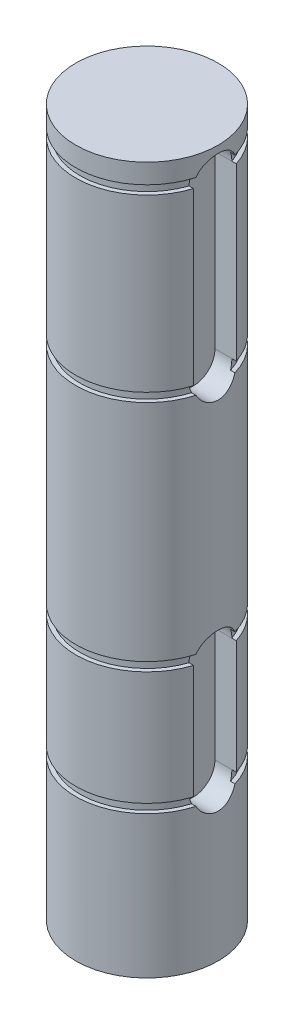
ISO-10303-21;
HEADER;
FILE_DESCRIPTION(('STEP AP214'),'2;1');
FILE_NAME('part.step','',(''),(''),'','','');
FILE_SCHEMA(('AUTOMOTIVE_DESIGN { 1 0 10303 214 1 1 1 1 }'));
ENDSEC;
DATA;
#1=APPLICATION_CONTEXT('core data for automotive mechanical design processes');
#2=APPLICATION_PROTOCOL_DEFINITION('international standard','automotive_design',2000,#1);
#3=PRODUCT_CONTEXT('',#1,'mechanical');
#4=PRODUCT('Part','Part','',(#3));
#5=PRODUCT_RELATED_PRODUCT_CATEGORY('part','',(#4));
#6=PRODUCT_DEFINITION_FORMATION('','',#4);
#7=PRODUCT_DEFINITION_CONTEXT('part definition',#1,'design');
#8=PRODUCT_DEFINITION('design','',#6,#7);
#9=PRODUCT_DEFINITION_SHAPE('','',#8);
#10=(LENGTH_UNIT() NAMED_UNIT(*) SI_UNIT(.MILLI.,.METRE.));
#11=(NAMED_UNIT(*) PLANE_ANGLE_UNIT() SI_UNIT($,.RADIAN.));
#12=(NAMED_UNIT(*) SI_UNIT($,.STERADIAN.) SOLID_ANGLE_UNIT());
#13=UNCERTAINTY_MEASURE_WITH_UNIT(LENGTH_MEASURE(1.E-05),#10,'distance_accuracy_value','');
#14=(GEOMETRIC_REPRESENTATION_CONTEXT(3) GLOBAL_UNCERTAINTY_ASSIGNED_CONTEXT((#13)) GLOBAL_UNIT_ASSIGNED_CONTEXT((#10,
#11,#12)) REPRESENTATION_CONTEXT('',''));
#15=CARTESIAN_POINT('',(0.,0.,0.));
#16=DIRECTION('',(0.,0.,1.));
#17=DIRECTION('',(1.,0.,0.));
#18=AXIS2_PLACEMENT_3D('',#15,#16,#17);
#19=CARTESIAN_POINT('',(0.,31.02,0.));
#20=DIRECTION('',(0.,-1.,0.));
#21=DIRECTION('',(0.,0.,-1.));
#22=AXIS2_PLACEMENT_3D('',#19,#20,#21);
#23=CYLINDRICAL_SURFACE('',#22,3.125);
#24=DIRECTION('',(0.,-1.,0.));
#25=VECTOR('',#24,1.);
#26=CARTESIAN_POINT('',(2.98027263853494,31.02,-0.939999999999998));
#27=LINE('',#26,#25);
#28=CARTESIAN_POINT('',(2.98027263853494,6.64,-0.94));
#29=VERTEX_POINT('',#28);
#30=CARTESIAN_POINT('',(2.98027263853494,11.64,-0.94));
#31=VERTEX_POINT('',#30);
#32=EDGE_CURVE('E691',#29,#31,#27,.F.);
#33=ORIENTED_EDGE('',*,*,#32,.F.);
#34=CARTESIAN_POINT('',(0.,6.64,0.));
#35=DIRECTION('',(0.,1.,0.));
#36=DIRECTION('',(0.,0.,1.));
#37=AXIS2_PLACEMENT_3D('',#34,#35,#36);
#38=CIRCLE('',#37,3.125);
#39=CARTESIAN_POINT('',(2.98027263853494,6.64,0.939999999999999));
#40=VERTEX_POINT('',#39);
#41=EDGE_CURVE('E321',#29,#40,#38,.T.);
#42=ORIENTED_EDGE('',*,*,#41,.T.);
#43=DIRECTION('',(0.,-1.,0.));
#44=VECTOR('',#43,1.);
#45=CARTESIAN_POINT('',(2.98027263853494,31.02,0.940000000000003));
#46=LINE('',#45,#44);
#47=CARTESIAN_POINT('',(2.98027263853494,11.64,0.94));
#48=VERTEX_POINT('',#47);
#49=EDGE_CURVE('E695',#40,#48,#46,.F.);
#50=ORIENTED_EDGE('',*,*,#49,.T.);
#51=CARTESIAN_POINT('',(0.,11.64,0.));
#52=DIRECTION('',(0.,-1.,0.));
#53=DIRECTION('',(0.,0.,-1.));
#54=AXIS2_PLACEMENT_3D('',#51,#52,#53);
#55=CIRCLE('',#54,3.125);
#56=EDGE_CURVE('E329',#48,#31,#55,.T.);
#57=ORIENTED_EDGE('',*,*,#56,.T.);
#58=EDGE_LOOP('',(#33,#42,#50,#57));
#59=FACE_BOUND('',#58,.T.);
#60=ADVANCED_FACE('F33',(#59),#23,.T.);
#61=CARTESIAN_POINT('',(0.,11.64,6.6989213564024));
#62=DIRECTION('',(0.,-1.,0.));
#63=DIRECTION('',(0.,0.,-1.));
#64=AXIS2_PLACEMENT_3D('',#61,#62,#63);
#65=PLANE('',#64);
#66=DIRECTION('',(1.,0.,0.));
#67=VECTOR('',#66,1.);
#68=CARTESIAN_POINT('',(2.045,11.64,-0.94));
#69=LINE('',#68,#67);
#70=CARTESIAN_POINT('',(2.78567765543682,11.64,-0.94));
#71=VERTEX_POINT('',#70);
#72=EDGE_CURVE('E205',#71,#31,#69,.T.);
#73=ORIENTED_EDGE('',*,*,#72,.T.);
#74=ORIENTED_EDGE('',*,*,#56,.F.);
#75=DIRECTION('',(1.,0.,0.));
#76=VECTOR('',#75,1.);
#77=CARTESIAN_POINT('',(2.045,11.64,0.94));
#78=LINE('',#77,#76);
#79=CARTESIAN_POINT('',(2.78567765543682,11.64,0.94));
#80=VERTEX_POINT('',#79);
#81=EDGE_CURVE('E184',#80,#48,#78,.T.);
#82=ORIENTED_EDGE('',*,*,#81,.F.);
#83=CARTESIAN_POINT('',(0.,11.64,0.));
#84=DIRECTION('',(0.,1.,0.));
#85=DIRECTION('',(0.,0.,1.));
#86=AXIS2_PLACEMENT_3D('',#83,#84,#85);
#87=CIRCLE('',#86,2.94);
#88=EDGE_CURVE('E330',#71,#80,#87,.T.);
#89=ORIENTED_EDGE('',*,*,#88,.F.);
#90=EDGE_LOOP('',(#73,#74,#82,#89));
#91=FACE_BOUND('',#90,.T.);
#92=ADVANCED_FACE('F252',(#91),#65,.F.);
#93=DIRECTION('',(0.,-1.,0.));
#94=VECTOR('',#93,1.);
#95=CARTESIAN_POINT('',(2.98027263853494,31.02,-0.94));
#96=LINE('',#95,#94);
#97=CARTESIAN_POINT('',(2.98027263853494,22.27,-0.94));
#98=VERTEX_POINT('',#97);
#99=CARTESIAN_POINT('',(2.98027263853494,29.77,-0.94));
#100=VERTEX_POINT('',#99);
#101=EDGE_CURVE('E484',#98,#100,#96,.F.);
#102=ORIENTED_EDGE('',*,*,#101,.F.);
#103=CARTESIAN_POINT('',(0.,22.27,0.));
#104=DIRECTION('',(0.,1.,0.));
#105=DIRECTION('',(0.,0.,1.));
#106=AXIS2_PLACEMENT_3D('',#103,#104,#105);
#107=CIRCLE('',#106,3.125);
#108=CARTESIAN_POINT('',(2.98027263853494,22.27,0.939999999999999));
#109=VERTEX_POINT('',#108);
#110=EDGE_CURVE('E334',#98,#109,#107,.T.);
#111=ORIENTED_EDGE('',*,*,#110,.T.);
#112=DIRECTION('',(0.,-1.,0.));
#113=VECTOR('',#112,1.);
#114=CARTESIAN_POINT('',(2.98027263853494,31.02,0.94));
#115=LINE('',#114,#113);
#116=CARTESIAN_POINT('',(2.98027263853494,29.77,0.94));
#117=VERTEX_POINT('',#116);
#118=EDGE_CURVE('E482',#109,#117,#115,.F.);
#119=ORIENTED_EDGE('',*,*,#118,.T.);
#120=CARTESIAN_POINT('',(0.,29.77,0.));
#121=DIRECTION('',(0.,-1.,0.));
#122=DIRECTION('',(0.,0.,-1.));
#123=AXIS2_PLACEMENT_3D('',#120,#121,#122);
#124=CIRCLE('',#123,3.125);
#125=EDGE_CURVE('E343',#117,#100,#124,.T.);
#126=ORIENTED_EDGE('',*,*,#125,.T.);
#127=EDGE_LOOP('',(#102,#111,#119,#126));
#128=FACE_BOUND('',#127,.T.);
#129=ADVANCED_FACE('F256',(#128),#23,.T.);
#130=CARTESIAN_POINT('',(0.,29.77,8.25905998612194));
#131=DIRECTION('',(0.,-1.,0.));
#132=DIRECTION('',(0.,0.,-1.));
#133=AXIS2_PLACEMENT_3D('',#130,#131,#132);
#134=PLANE('',#133);
#135=DIRECTION('',(1.,0.,0.));
#136=VECTOR('',#135,1.);
#137=CARTESIAN_POINT('',(2.045,29.77,-0.94));
#138=LINE('',#137,#136);
#139=CARTESIAN_POINT('',(2.78567765543682,29.77,-0.94));
#140=VERTEX_POINT('',#139);
#141=EDGE_CURVE('E466',#140,#100,#138,.T.);
#142=ORIENTED_EDGE('',*,*,#141,.T.);
#143=ORIENTED_EDGE('',*,*,#125,.F.);
#144=DIRECTION('',(1.,0.,0.));
#145=VECTOR('',#144,1.);
#146=CARTESIAN_POINT('',(2.045,29.77,0.94));
#147=LINE('',#146,#145);
#148=CARTESIAN_POINT('',(2.78567765543682,29.77,0.94));
#149=VERTEX_POINT('',#148);
#150=EDGE_CURVE('E462',#149,#117,#147,.T.);
#151=ORIENTED_EDGE('',*,*,#150,.F.);
#152=CARTESIAN_POINT('',(0.,29.77,0.));
#153=DIRECTION('',(0.,1.,0.));
#154=DIRECTION('',(0.,0.,1.));
#155=AXIS2_PLACEMENT_3D('',#152,#153,#154);
#156=CIRCLE('',#155,2.94);
#157=EDGE_CURVE('E344',#140,#149,#156,.T.);
#158=ORIENTED_EDGE('',*,*,#157,.F.);
#159=EDGE_LOOP('',(#142,#143,#151,#158));
#160=FACE_BOUND('',#159,.T.);
#161=ADVANCED_FACE('F291',(#160),#134,.F.);
#162=CARTESIAN_POINT('',(0.,21.88,0.));
#163=DIRECTION('',(0.,-1.,0.));
#164=DIRECTION('',(0.,0.,-1.));
#165=AXIS2_PLACEMENT_3D('',#162,#163,#164);
#166=CIRCLE('',#165,3.125);
#167=CARTESIAN_POINT('',(3.00568211892076,21.88,0.855277732669335));
#168=VERTEX_POINT('',#167);
#169=CARTESIAN_POINT('',(3.00568211892076,21.88,-0.855277732669335));
#170=VERTEX_POINT('',#169);
#171=EDGE_CURVE('E337',#168,#170,#166,.T.);
#172=ORIENTED_EDGE('',*,*,#171,.T.);
#173=CARTESIAN_POINT('',(3.00568211892076,21.88,-0.855277732669335));
#174=CARTESIAN_POINT('',(3.01197611217758,21.8313698895519,-0.833136228877787));
#175=CARTESIAN_POINT('',(3.01919775324544,21.7847898873477,-0.806858075150072));
#176=CARTESIAN_POINT('',(3.03458192240252,21.6968394871603,-0.746928149763597));
#177=CARTESIAN_POINT('',(3.04274406058385,21.6554669450655,-0.713279428592252));
#178=CARTESIAN_POINT('',(3.05910120550064,21.5790003474044,-0.63948971254401));
#179=CARTESIAN_POINT('',(3.06729621095687,21.5439060498633,-0.599348967994875));
#180=CARTESIAN_POINT('',(3.08281079902333,21.4809318372791,-0.513612744111755));
#181=CARTESIAN_POINT('',(3.0901305429699,21.4530505915533,-0.468018273168346));
#182=CARTESIAN_POINT('',(3.10308315937434,21.4053442344126,-0.372579156757472));
#183=CARTESIAN_POINT('',(3.10871654938764,21.3855166505968,-0.322735821346341));
#184=CARTESIAN_POINT('',(3.11765565733985,21.3545914483087,-0.220209060884308));
#185=CARTESIAN_POINT('',(3.12096182013791,21.3434921613387,-0.167526180698143));
#186=CARTESIAN_POINT('',(3.12478789265651,21.3306864235816,-0.0629395106332579));
#187=CARTESIAN_POINT('',(3.12540746867013,21.328643919445,-0.0110803793365449));
#188=CARTESIAN_POINT('',(3.12406570105473,21.3331082537071,0.0922290153420545));
#189=CARTESIAN_POINT('',(3.12210470969837,21.3396139251961,0.143679333566428));
#190=CARTESIAN_POINT('',(3.11587937110205,21.3607270041869,0.243690581712505));
#191=CARTESIAN_POINT('',(3.11166026711456,21.3751754211278,0.292288134105934));
#192=CARTESIAN_POINT('',(3.10138427837202,21.4115925566497,0.386370452039638));
#193=CARTESIAN_POINT('',(3.09532708770704,21.4335625271093,0.431854697891666));
#194=CARTESIAN_POINT('',(3.08180586284076,21.4850578680789,0.519738685975642));
#195=CARTESIAN_POINT('',(3.07430890253973,21.514767430438,0.562025261028504));
#196=CARTESIAN_POINT('',(3.05879365274378,21.580640257947,0.641117728480937));
#197=CARTESIAN_POINT('',(3.05077539725478,21.6168031023944,0.677923977867188));
#198=CARTESIAN_POINT('',(3.03612090925513,21.689408020399,0.740601235513018));
#199=CARTESIAN_POINT('',(3.02944450317571,21.7251499149957,0.767278041987932));
#200=CARTESIAN_POINT('',(3.01685829784125,21.8001198007243,0.81535345165774));
#201=CARTESIAN_POINT('',(3.01094815880578,21.8393462336387,0.83675439811143));
#202=CARTESIAN_POINT('',(3.00568211892076,21.88,0.855277732669335));
#203=B_SPLINE_CURVE_WITH_KNOTS('',3,(#173,#174,#175,#176,#177,#178,#179,#180,#181,#182,#183,
#184,#185,#186,#187,#188,#189,#190,#191,#192,#193,#194,#195,#196,#197,#198,#199,#200,#201,#202),
.UNSPECIFIED.,.F.,.F.,(4,2,2,2,2,2,2,2,2,2,2,2,2,2,4),(0.,0.161152208374374,0.3222378456118,
0.483317272982924,0.644366962775478,0.805367174343245,0.966336601687735,1.12128038599228,
1.27620302115001,1.42813187036151,1.58008601873696,1.73605274217507,1.89200930154131,
2.02685875712088,2.16164821133935),.UNSPECIFIED.);
#204=EDGE_CURVE('E406',#170,#168,#203,.T.);
#205=ORIENTED_EDGE('',*,*,#204,.T.);
#206=EDGE_LOOP('',(#172,#205));
#207=FACE_BOUND('',#206,.T.);
#208=CARTESIAN_POINT('',(0.,12.03,0.));
#209=DIRECTION('',(0.,1.,0.));
#210=DIRECTION('',(0.,0.,1.));
#211=AXIS2_PLACEMENT_3D('',#208,#209,#210);
#212=CIRCLE('',#211,3.125);
#213=CARTESIAN_POINT('',(3.00568211892076,12.03,-0.855277732669336));
#214=VERTEX_POINT('',#213);
#215=CARTESIAN_POINT('',(3.00568211892076,12.03,0.855277732669337));
#216=VERTEX_POINT('',#215);
#217=EDGE_CURVE('E326',#214,#216,#212,.T.);
#218=ORIENTED_EDGE('',*,*,#217,.T.);
#219=CARTESIAN_POINT('',(3.00568211892076,12.03,0.855277732669337));
#220=CARTESIAN_POINT('',(3.01197611217757,12.0786301104481,0.833136228877789));
#221=CARTESIAN_POINT('',(3.01919775324544,12.1252101126523,0.806858075150075));
#222=CARTESIAN_POINT('',(3.03458192240252,12.2131605128397,0.746928149763601));
#223=CARTESIAN_POINT('',(3.04274406058385,12.2545330549345,0.713279428592255));
#224=CARTESIAN_POINT('',(3.05910120550064,12.3309996525956,0.639489712544013));
#225=CARTESIAN_POINT('',(3.06729621095687,12.3660939501367,0.599348967994878));
#226=CARTESIAN_POINT('',(3.08281079902333,12.4290681627209,0.513612744111759));
#227=CARTESIAN_POINT('',(3.0901305429699,12.4569494084467,0.46801827316835));
#228=CARTESIAN_POINT('',(3.10308315937434,12.5046557655874,0.372579156757477));
#229=CARTESIAN_POINT('',(3.10871654938764,12.5244833494032,0.322735821346345));
#230=CARTESIAN_POINT('',(3.11765565733985,12.5554085516913,0.220209060884311));
#231=CARTESIAN_POINT('',(3.12096182013791,12.5665078386613,0.167526180698147));
#232=CARTESIAN_POINT('',(3.12478789265651,12.5793135764184,0.0629395106332619));
#233=CARTESIAN_POINT('',(3.12540746867013,12.5813560805551,0.0110803793365491));
#234=CARTESIAN_POINT('',(3.12406570105473,12.576891746293,-0.0922290153420505));
#235=CARTESIAN_POINT('',(3.12210470969837,12.5703860748039,-0.143679333566424));
#236=CARTESIAN_POINT('',(3.11587937110205,12.5492729958131,-0.243690581712502));
#237=CARTESIAN_POINT('',(3.11166026711456,12.5348245788722,-0.292288134105929));
#238=CARTESIAN_POINT('',(3.10138427837202,12.4984074433503,-0.386370452039633));
#239=CARTESIAN_POINT('',(3.09532708770704,12.4764374728907,-0.431854697891662));
#240=CARTESIAN_POINT('',(3.08180586284076,12.4249421319211,-0.519738685975639));
#241=CARTESIAN_POINT('',(3.07430890253973,12.395232569562,-0.562025261028501));
#242=CARTESIAN_POINT('',(3.05879365274378,12.3293597420531,-0.641117728480934));
#243=CARTESIAN_POINT('',(3.05077539725478,12.2931968976056,-0.677923977867185));
#244=CARTESIAN_POINT('',(3.03612090925513,12.220591979601,-0.740601235513016));
#245=CARTESIAN_POINT('',(3.02944450317571,12.1848500850043,-0.767278041987931));
#246=CARTESIAN_POINT('',(3.01685829784125,12.1098801992757,-0.815353451657741));
#247=CARTESIAN_POINT('',(3.01094815880578,12.0706537663613,-0.836754398111431));
#248=CARTESIAN_POINT('',(3.00568211892076,12.03,-0.855277732669337));
#249=B_SPLINE_CURVE_WITH_KNOTS('',3,(#219,#220,#221,#222,#223,#224,#225,#226,#227,#228,#229,
#230,#231,#232,#233,#234,#235,#236,#237,#238,#239,#240,#241,#242,#243,#244,#245,#246,#247,#248),
.UNSPECIFIED.,.F.,.F.,(4,2,2,2,2,2,2,2,2,2,2,2,2,2,4),(0.,0.161152208374372,0.322237845611799,
0.483317272982923,0.644366962775477,0.805367174343245,0.966336601687735,1.12128038599228,
1.27620302115001,1.42813187036151,1.58008601873696,1.73605274217507,1.89200930154131,
2.02685875712089,2.16164821133936),.UNSPECIFIED.);
#250=EDGE_CURVE('E213',#216,#214,#249,.T.);
#251=ORIENTED_EDGE('',*,*,#250,.T.);
#252=EDGE_LOOP('',(#218,#251));
#253=FACE_BOUND('',#252,.T.);
#254=ADVANCED_FACE('F282',(#207,#253),#23,.T.);
#255=CARTESIAN_POINT('',(0.,6.25,0.));
#256=DIRECTION('',(0.,-1.,0.));
#257=DIRECTION('',(0.,0.,-1.));
#258=AXIS2_PLACEMENT_3D('',#255,#256,#257);
#259=CIRCLE('',#258,3.125);
#260=CARTESIAN_POINT('',(3.00568211892076,6.25,0.855277732669337));
#261=VERTEX_POINT('',#260);
#262=CARTESIAN_POINT('',(3.00568211892076,6.25,-0.855277732669336));
#263=VERTEX_POINT('',#262);
#264=EDGE_CURVE('E315',#261,#263,#259,.T.);
#265=ORIENTED_EDGE('',*,*,#264,.T.);
#266=CARTESIAN_POINT('',(3.00568211892076,6.25,-0.855277732669337));
#267=CARTESIAN_POINT('',(3.01197611217757,6.20136988955189,-0.83313622887779));
#268=CARTESIAN_POINT('',(3.01919775324544,6.15478988734766,-0.806858075150075));
#269=CARTESIAN_POINT('',(3.03458192240252,6.06683948716027,-0.7469281497636));
#270=CARTESIAN_POINT('',(3.04274406058385,6.02546694506551,-0.713279428592254));
#271=CARTESIAN_POINT('',(3.05910120550064,5.9490003474044,-0.639489712544012));
#272=CARTESIAN_POINT('',(3.06729621095687,5.91390604986329,-0.599348967994876));
#273=CARTESIAN_POINT('',(3.08281079902333,5.85093183727906,-0.513612744111757));
#274=CARTESIAN_POINT('',(3.0901305429699,5.8230505915533,-0.468018273168348));
#275=CARTESIAN_POINT('',(3.10308315937434,5.77534423441264,-0.372579156757475));
#276=CARTESIAN_POINT('',(3.10871654938764,5.7555166505968,-0.322735821346343));
#277=CARTESIAN_POINT('',(3.11765565733985,5.72459144830873,-0.22020906088431));
#278=CARTESIAN_POINT('',(3.12096182013791,5.71349216133873,-0.167526180698146));
#279=CARTESIAN_POINT('',(3.12478789265651,5.70068642358156,-0.0629395106332611));
#280=CARTESIAN_POINT('',(3.12540746867013,5.69864391944495,-0.0110803793365481));
#281=CARTESIAN_POINT('',(3.12406570105473,5.70310825370705,0.0922290153420516));
#282=CARTESIAN_POINT('',(3.12210470969837,5.70961392519606,0.143679333566425));
#283=CARTESIAN_POINT('',(3.11587937110205,5.73072700418688,0.243690581712502));
#284=CARTESIAN_POINT('',(3.11166026711456,5.74517542112777,0.29228813410593));
#285=CARTESIAN_POINT('',(3.10138427837202,5.78159255664966,0.386370452039634));
#286=CARTESIAN_POINT('',(3.09532708770704,5.80356252710926,0.431854697891663));
#287=CARTESIAN_POINT('',(3.08180586284076,5.85505786807891,0.51973868597564));
#288=CARTESIAN_POINT('',(3.07430890253973,5.884767430438,0.562025261028502));
#289=CARTESIAN_POINT('',(3.05879365274378,5.95064025794695,0.641117728480935));
#290=CARTESIAN_POINT('',(3.05077539725478,5.98680310239438,0.677923977867186));
#291=CARTESIAN_POINT('',(3.03612090925513,6.05940802039897,0.740601235513017));
#292=CARTESIAN_POINT('',(3.02944450317571,6.09514991499573,0.767278041987932));
#293=CARTESIAN_POINT('',(3.01685829784125,6.17011980072427,0.815353451657741));
#294=CARTESIAN_POINT('',(3.01094815880577,6.20934623363868,0.836754398111432));
#295=CARTESIAN_POINT('',(3.00568211892076,6.25,0.855277732669337));
#296=B_SPLINE_CURVE_WITH_KNOTS('',3,(#266,#267,#268,#269,#270,#271,#272,#273,#274,#275,#276,
#277,#278,#279,#280,#281,#282,#283,#284,#285,#286,#287,#288,#289,#290,#291,#292,#293,#294,#295),
.UNSPECIFIED.,.F.,.F.,(4,2,2,2,2,2,2,2,2,2,2,2,2,2,4),(0.,0.161152208374373,0.3222378456118,
0.483317272982925,0.64436696277548,0.805367174343246,0.966336601687735,1.12128038599228,
1.27620302115001,1.42813187036151,1.58008601873696,1.73605274217507,1.89200930154131,
2.02685875712089,2.16164821133936),.UNSPECIFIED.);
#297=EDGE_CURVE('E444',#263,#261,#296,.T.);
#298=ORIENTED_EDGE('',*,*,#297,.T.);
#299=EDGE_LOOP('',(#265,#298));
#300=FACE_BOUND('',#299,.T.);
#301=CARTESIAN_POINT('',(0.,0.,0.));
#302=DIRECTION('',(0.,1.,0.));
#303=DIRECTION('',(0.,0.,1.));
#304=AXIS2_PLACEMENT_3D('',#301,#302,#303);
#305=CIRCLE('',#304,3.125);
#306=CARTESIAN_POINT('',(0.,0.,3.125));
#307=VERTEX_POINT('',#306);
#308=EDGE_CURVE('E310',#307,#307,#305,.T.);
#309=ORIENTED_EDGE('',*,*,#308,.T.);
#310=EDGE_LOOP('',(#309));
#311=FACE_BOUND('',#310,.T.);
#312=ADVANCED_FACE('F277',(#300,#311),#23,.T.);
#313=CARTESIAN_POINT('',(0.,0.,0.));
#314=DIRECTION('',(0.,1.,0.));
#315=DIRECTION('',(0.,0.,1.));
#316=AXIS2_PLACEMENT_3D('',#313,#314,#315);
#317=PLANE('',#316);
#318=ORIENTED_EDGE('',*,*,#308,.F.);
#319=EDGE_LOOP('',(#318));
#320=FACE_BOUND('',#319,.T.);
#321=ADVANCED_FACE('F270',(#320),#317,.F.);
#322=CARTESIAN_POINT('',(0.,6.25,6.84511449295975));
#323=DIRECTION('',(0.,-1.,0.));
#324=DIRECTION('',(0.,0.,-1.));
#325=AXIS2_PLACEMENT_3D('',#322,#323,#324);
#326=PLANE('',#325);
#327=CARTESIAN_POINT('',(0.,6.25,0.));
#328=DIRECTION('',(0.,1.,0.));
#329=DIRECTION('',(0.,0.,1.));
#330=AXIS2_PLACEMENT_3D('',#327,#328,#329);
#331=CIRCLE('',#330,2.94);
#332=CARTESIAN_POINT('',(2.81284553432996,6.25,-0.855277732669336));
#333=VERTEX_POINT('',#332);
#334=CARTESIAN_POINT('',(2.81284553432996,6.25,0.855277732669336));
#335=VERTEX_POINT('',#334);
#336=EDGE_CURVE('E318',#333,#335,#331,.T.);
#337=ORIENTED_EDGE('',*,*,#336,.F.);
#338=DIRECTION('',(1.,0.,0.));
#339=VECTOR('',#338,1.);
#340=CARTESIAN_POINT('',(2.045,6.25,-0.855277732669336));
#341=LINE('',#340,#339);
#342=EDGE_CURVE('E439',#333,#263,#341,.T.);
#343=ORIENTED_EDGE('',*,*,#342,.T.);
#344=ORIENTED_EDGE('',*,*,#264,.F.);
#345=DIRECTION('',(1.,0.,0.));
#346=VECTOR('',#345,1.);
#347=CARTESIAN_POINT('',(2.045,6.25,0.855277732669336));
#348=LINE('',#347,#346);
#349=EDGE_CURVE('E441',#261,#335,#348,.F.);
#350=ORIENTED_EDGE('',*,*,#349,.T.);
#351=EDGE_LOOP('',(#337,#343,#344,#350));
#352=FACE_BOUND('',#351,.T.);
#353=ADVANCED_FACE('F261',(#352),#326,.F.);
#354=CARTESIAN_POINT('',(0.,6.64,6.84511449295975));
#355=DIRECTION('',(0.,1.,0.));
#356=DIRECTION('',(0.,0.,1.));
#357=AXIS2_PLACEMENT_3D('',#354,#355,#356);
#358=PLANE('',#357);
#359=ORIENTED_EDGE('',*,*,#41,.F.);
#360=DIRECTION('',(1.,0.,0.));
#361=VECTOR('',#360,1.);
#362=CARTESIAN_POINT('',(2.045,6.64,-0.94));
#363=LINE('',#362,#361);
#364=CARTESIAN_POINT('',(2.78567765543682,6.64,-0.94));
#365=VERTEX_POINT('',#364);
#366=EDGE_CURVE('E209',#365,#29,#363,.T.);
#367=ORIENTED_EDGE('',*,*,#366,.F.);
#368=CARTESIAN_POINT('',(0.,6.64,0.));
#369=DIRECTION('',(0.,1.,0.));
#370=DIRECTION('',(0.,0.,1.));
#371=AXIS2_PLACEMENT_3D('',#368,#369,#370);
#372=CIRCLE('',#371,2.94);
#373=CARTESIAN_POINT('',(2.78567765543682,6.64,0.939999999999999));
#374=VERTEX_POINT('',#373);
#375=EDGE_CURVE('E333',#365,#374,#372,.T.);
#376=ORIENTED_EDGE('',*,*,#375,.T.);
#377=DIRECTION('',(1.,0.,0.));
#378=VECTOR('',#377,1.);
#379=CARTESIAN_POINT('',(2.045,6.64,0.939999999999999));
#380=LINE('',#379,#378);
#381=EDGE_CURVE('E183',#374,#40,#380,.T.);
#382=ORIENTED_EDGE('',*,*,#381,.T.);
#383=EDGE_LOOP('',(#359,#367,#376,#382));
#384=FACE_BOUND('',#383,.T.);
#385=ADVANCED_FACE('F258',(#384),#358,.F.);
#386=CARTESIAN_POINT('',(0.,10.0729141627472,0.));
#387=DIRECTION('',(0.,1.,0.));
#388=DIRECTION('',(0.,0.,1.));
#389=AXIS2_PLACEMENT_3D('',#386,#387,#388);
#390=CYLINDRICAL_SURFACE('',#389,2.94);
#391=ORIENTED_EDGE('',*,*,#336,.T.);
#392=CARTESIAN_POINT('',(2.81284553432996,6.25,0.855277732669336));
#393=CARTESIAN_POINT('',(2.80962420412877,6.27323102802891,0.865868839296419));
#394=CARTESIAN_POINT('',(2.80662530230957,6.29690351095009,0.875520790514264));
#395=CARTESIAN_POINT('',(2.80114911567704,6.34502602155902,0.892886991001807));
#396=CARTESIAN_POINT('',(2.79867220113995,6.36947658712978,0.900599865513931));
#397=CARTESIAN_POINT('',(2.79223222806882,6.44280706828887,0.920454844259724));
#398=CARTESIAN_POINT('',(2.78912666245954,6.49259541653227,0.929736167627468));
#399=CARTESIAN_POINT('',(2.78681172238269,6.55886570549013,0.93663303760505));
#400=CARTESIAN_POINT('',(2.78638867569603,6.57500305367463,0.93789043435678));
#401=CARTESIAN_POINT('',(2.78582098723808,6.60742381747301,0.939575805008161));
#402=CARTESIAN_POINT('',(2.78567804516857,6.62370752615054,0.939998715270498));
#403=CARTESIAN_POINT('',(2.78567765543718,6.64000000000001,0.940000000000013));
#404=B_SPLINE_CURVE_WITH_KNOTS('',3,(#392,#393,#394,#395,#396,#397,#398,#399,#400,#401,#402,
#403),.UNSPECIFIED.,.F.,.F.,(4,2,2,2,2,4),(0.,0.0771464240473589,0.154347389737972,
0.305695903377029,0.35425595785119,0.40310977795661),.UNSPECIFIED.);
#405=EDGE_CURVE('E11',#335,#374,#404,.T.);
#406=ORIENTED_EDGE('',*,*,#405,.T.);
#407=ORIENTED_EDGE('',*,*,#375,.F.);
#408=CARTESIAN_POINT('',(2.78567765543682,6.64,-0.94));
#409=CARTESIAN_POINT('',(2.78567565605409,6.61426266760782,-0.93999934357065));
#410=CARTESIAN_POINT('',(2.78603489982322,6.58854375069678,-0.938941929835824));
#411=CARTESIAN_POINT('',(2.78745296559651,6.53729081633707,-0.934726402618063));
#412=CARTESIAN_POINT('',(2.78851198112351,6.51175685201266,-0.931567708021433));
#413=CARTESIAN_POINT('',(2.79265006900997,6.43665475682132,-0.919122011058206));
#414=CARTESIAN_POINT('',(2.79669238647367,6.38758114337944,-0.906862802914509));
#415=CARTESIAN_POINT('',(2.80342140621578,6.32471258358338,-0.885695044658838));
#416=CARTESIAN_POINT('',(2.80516424355536,6.3095933291033,-0.88016549762303));
#417=CARTESIAN_POINT('',(2.8088563889898,6.27959001794227,-0.868311653099244));
#418=CARTESIAN_POINT('',(2.81080686256113,6.26470789299,-0.861982827801099));
#419=CARTESIAN_POINT('',(2.81284553433009,6.24999999999998,-0.855277732669433));
#420=B_SPLINE_CURVE_WITH_KNOTS('',3,(#408,#409,#410,#411,#412,#413,#414,#415,#416,#417,#418,
#419),.UNSPECIFIED.,.F.,.F.,(4,2,2,2,2,4),(0.,0.0771515142282885,0.154324373746961,
0.305691769349301,0.354256775782618,0.40311039789905),.UNSPECIFIED.);
#421=EDGE_CURVE('E47',#365,#333,#420,.T.);
#422=ORIENTED_EDGE('',*,*,#421,.T.);
#423=EDGE_LOOP('',(#391,#406,#407,#422));
#424=FACE_BOUND('',#423,.T.);
#425=ADVANCED_FACE('F260',(#424),#390,.T.);
#426=CARTESIAN_POINT('',(0.,12.03,6.6989213564024));
#427=DIRECTION('',(0.,1.,0.));
#428=DIRECTION('',(0.,0.,1.));
#429=AXIS2_PLACEMENT_3D('',#426,#427,#428);
#430=PLANE('',#429);
#431=CARTESIAN_POINT('',(0.,12.03,0.));
#432=DIRECTION('',(0.,1.,0.));
#433=DIRECTION('',(0.,0.,1.));
#434=AXIS2_PLACEMENT_3D('',#431,#432,#433);
#435=CIRCLE('',#434,2.94);
#436=CARTESIAN_POINT('',(2.81284553432996,12.03,-0.855277732669336));
#437=VERTEX_POINT('',#436);
#438=CARTESIAN_POINT('',(2.81284553432996,12.03,0.855277732669336));
#439=VERTEX_POINT('',#438);
#440=EDGE_CURVE('E341',#437,#439,#435,.T.);
#441=ORIENTED_EDGE('',*,*,#440,.T.);
#442=DIRECTION('',(1.,0.,0.));
#443=VECTOR('',#442,1.);
#444=CARTESIAN_POINT('',(2.045,12.03,0.855277732669336));
#445=LINE('',#444,#443);
#446=EDGE_CURVE('E219',#439,#216,#445,.T.);
#447=ORIENTED_EDGE('',*,*,#446,.T.);
#448=ORIENTED_EDGE('',*,*,#217,.F.);
#449=DIRECTION('',(1.,0.,0.));
#450=VECTOR('',#449,1.);
#451=CARTESIAN_POINT('',(2.045,12.03,-0.855277732669336));
#452=LINE('',#451,#450);
#453=EDGE_CURVE('E204',#214,#437,#452,.F.);
#454=ORIENTED_EDGE('',*,*,#453,.T.);
#455=EDGE_LOOP('',(#441,#447,#448,#454));
#456=FACE_BOUND('',#455,.T.);
#457=ADVANCED_FACE('F249',(#456),#430,.F.);
#458=CARTESIAN_POINT('',(0.,13.6866689305056,0.));
#459=DIRECTION('',(0.,1.,0.));
#460=DIRECTION('',(0.,0.,1.));
#461=AXIS2_PLACEMENT_3D('',#458,#459,#460);
#462=CYLINDRICAL_SURFACE('',#461,2.94);
#463=ORIENTED_EDGE('',*,*,#88,.T.);
#464=CARTESIAN_POINT('',(2.78567765543682,11.64,0.94));
#465=CARTESIAN_POINT('',(2.78567565605409,11.6657373323922,0.93999934357065));
#466=CARTESIAN_POINT('',(2.78603489982322,11.6914562493032,0.938941929835824));
#467=CARTESIAN_POINT('',(2.78745296559651,11.7427091836629,0.934726402618063));
#468=CARTESIAN_POINT('',(2.78851198112351,11.7682431479873,0.931567708021433));
#469=CARTESIAN_POINT('',(2.79265006900997,11.8433452431787,0.919122011058206));
#470=CARTESIAN_POINT('',(2.79669238647366,11.8924188566206,0.906862802914509));
#471=CARTESIAN_POINT('',(2.80342140621578,11.9552874164166,0.885695044658838));
#472=CARTESIAN_POINT('',(2.80516424355536,11.9704066708967,0.88016549762303));
#473=CARTESIAN_POINT('',(2.8088563889898,12.0004099820577,0.868311653099244));
#474=CARTESIAN_POINT('',(2.81080686256113,12.01529210701,0.861982827801099));
#475=CARTESIAN_POINT('',(2.81284553433009,12.03,0.855277732669433));
#476=B_SPLINE_CURVE_WITH_KNOTS('',3,(#464,#465,#466,#467,#468,#469,#470,#471,#472,#473,#474,
#475),.UNSPECIFIED.,.F.,.F.,(4,2,2,2,2,4),(0.,0.0771515142282876,0.154324373746962,
0.305691769349301,0.354256775782617,0.403110397899051),.UNSPECIFIED.);
#477=EDGE_CURVE('E180',#80,#439,#476,.T.);
#478=ORIENTED_EDGE('',*,*,#477,.T.);
#479=ORIENTED_EDGE('',*,*,#440,.F.);
#480=CARTESIAN_POINT('',(2.81284553432996,12.03,-0.855277732669336));
#481=CARTESIAN_POINT('',(2.80962420412877,12.0067689719711,-0.86586883929642));
#482=CARTESIAN_POINT('',(2.80662530230957,11.9830964890499,-0.875520790514265));
#483=CARTESIAN_POINT('',(2.80114911567704,11.934973978441,-0.892886991001807));
#484=CARTESIAN_POINT('',(2.79867220113995,11.9105234128702,-0.900599865513932));
#485=CARTESIAN_POINT('',(2.79223222806882,11.8371929317111,-0.920454844259724));
#486=CARTESIAN_POINT('',(2.78912666245954,11.7874045834677,-0.929736167627468));
#487=CARTESIAN_POINT('',(2.78681172238269,11.7211342945099,-0.93663303760505));
#488=CARTESIAN_POINT('',(2.78638867569603,11.7049969463254,-0.93789043435678));
#489=CARTESIAN_POINT('',(2.78582098723808,11.672576182527,-0.939575805008161));
#490=CARTESIAN_POINT('',(2.78567804516857,11.6562924738495,-0.939998715270498));
#491=CARTESIAN_POINT('',(2.78567765543718,11.64,-0.940000000000013));
#492=B_SPLINE_CURVE_WITH_KNOTS('',3,(#480,#481,#482,#483,#484,#485,#486,#487,#488,#489,#490,
#491),.UNSPECIFIED.,.F.,.F.,(4,2,2,2,2,4),(0.,0.0771464240473608,0.154347389737973,
0.305695903377029,0.354255957851191,0.403109777956609),.UNSPECIFIED.);
#493=EDGE_CURVE('E230',#437,#71,#492,.T.);
#494=ORIENTED_EDGE('',*,*,#493,.T.);
#495=EDGE_LOOP('',(#463,#478,#479,#494));
#496=FACE_BOUND('',#495,.T.);
#497=ADVANCED_FACE('F243',(#496),#462,.T.);
#498=CARTESIAN_POINT('',(0.,21.88,12.2648708855685));
#499=DIRECTION('',(0.,-1.,0.));
#500=DIRECTION('',(0.,0.,-1.));
#501=AXIS2_PLACEMENT_3D('',#498,#499,#500);
#502=PLANE('',#501);
#503=CARTESIAN_POINT('',(0.,21.88,0.));
#504=DIRECTION('',(0.,1.,0.));
#505=DIRECTION('',(0.,0.,1.));
#506=AXIS2_PLACEMENT_3D('',#503,#504,#505);
#507=CIRCLE('',#506,2.94);
#508=CARTESIAN_POINT('',(2.81284553432996,21.88,-0.855277732669335));
#509=VERTEX_POINT('',#508);
#510=CARTESIAN_POINT('',(2.81284553432996,21.88,0.855277732669335));
#511=VERTEX_POINT('',#510);
#512=EDGE_CURVE('E338',#509,#511,#507,.T.);
#513=ORIENTED_EDGE('',*,*,#512,.F.);
#514=DIRECTION('',(1.,0.,0.));
#515=VECTOR('',#514,1.);
#516=CARTESIAN_POINT('',(2.045,21.88,-0.855277732669335));
#517=LINE('',#516,#515);
#518=EDGE_CURVE('E413',#509,#170,#517,.T.);
#519=ORIENTED_EDGE('',*,*,#518,.T.);
#520=ORIENTED_EDGE('',*,*,#171,.F.);
#521=DIRECTION('',(1.,0.,0.));
#522=VECTOR('',#521,1.);
#523=CARTESIAN_POINT('',(2.045,21.88,0.855277732669335));
#524=LINE('',#523,#522);
#525=EDGE_CURVE('E412',#168,#511,#524,.F.);
#526=ORIENTED_EDGE('',*,*,#525,.T.);
#527=EDGE_LOOP('',(#513,#519,#520,#526));
#528=FACE_BOUND('',#527,.T.);
#529=ADVANCED_FACE('F248',(#528),#502,.F.);
#530=CARTESIAN_POINT('',(0.,22.27,12.2648708855685));
#531=DIRECTION('',(0.,1.,0.));
#532=DIRECTION('',(0.,0.,1.));
#533=AXIS2_PLACEMENT_3D('',#530,#531,#532);
#534=PLANE('',#533);
#535=ORIENTED_EDGE('',*,*,#110,.F.);
#536=DIRECTION('',(1.,0.,0.));
#537=VECTOR('',#536,1.);
#538=CARTESIAN_POINT('',(2.045,22.27,-0.94));
#539=LINE('',#538,#537);
#540=CARTESIAN_POINT('',(2.78567765543682,22.27,-0.94));
#541=VERTEX_POINT('',#540);
#542=EDGE_CURVE('E470',#541,#98,#539,.T.);
#543=ORIENTED_EDGE('',*,*,#542,.F.);
#544=CARTESIAN_POINT('',(0.,22.27,0.));
#545=DIRECTION('',(0.,1.,0.));
#546=DIRECTION('',(0.,0.,1.));
#547=AXIS2_PLACEMENT_3D('',#544,#545,#546);
#548=CIRCLE('',#547,2.94);
#549=CARTESIAN_POINT('',(2.78567765543682,22.27,0.939999999999999));
#550=VERTEX_POINT('',#549);
#551=EDGE_CURVE('E346',#541,#550,#548,.T.);
#552=ORIENTED_EDGE('',*,*,#551,.T.);
#553=DIRECTION('',(1.,0.,0.));
#554=VECTOR('',#553,1.);
#555=CARTESIAN_POINT('',(2.045,22.27,0.939999999999999));
#556=LINE('',#555,#554);
#557=EDGE_CURVE('E474',#550,#109,#556,.T.);
#558=ORIENTED_EDGE('',*,*,#557,.T.);
#559=EDGE_LOOP('',(#535,#543,#552,#558));
#560=FACE_BOUND('',#559,.T.);
#561=ADVANCED_FACE('F389',(#560),#534,.F.);
#562=CARTESIAN_POINT('',(0.,25.0149897830008,0.));
#563=DIRECTION('',(0.,1.,0.));
#564=DIRECTION('',(0.,0.,1.));
#565=AXIS2_PLACEMENT_3D('',#562,#563,#564);
#566=CYLINDRICAL_SURFACE('',#565,2.94);
#567=ORIENTED_EDGE('',*,*,#512,.T.);
#568=CARTESIAN_POINT('',(2.81284553432996,21.88,0.855277732669335));
#569=CARTESIAN_POINT('',(2.80962420412877,21.9032310280289,0.865868839296418));
#570=CARTESIAN_POINT('',(2.80662530230957,21.9269035109501,0.875520790514263));
#571=CARTESIAN_POINT('',(2.80114911567704,21.975026021559,0.892886991001806));
#572=CARTESIAN_POINT('',(2.79867220113995,21.9994765871298,0.900599865513931));
#573=CARTESIAN_POINT('',(2.79223222806882,22.0728070682889,0.920454844259725));
#574=CARTESIAN_POINT('',(2.78912666245954,22.1225954165323,0.929736167627468));
#575=CARTESIAN_POINT('',(2.78681172238269,22.1888657054901,0.93663303760505));
#576=CARTESIAN_POINT('',(2.78638867569603,22.2050030536746,0.93789043435678));
#577=CARTESIAN_POINT('',(2.78582098723808,22.237423817473,0.939575805008161));
#578=CARTESIAN_POINT('',(2.78567804516857,22.2537075261505,0.939998715270498));
#579=CARTESIAN_POINT('',(2.78567765543718,22.27,0.940000000000013));
#580=B_SPLINE_CURVE_WITH_KNOTS('',3,(#568,#569,#570,#571,#572,#573,#574,#575,#576,#577,#578,
#579),.UNSPECIFIED.,.F.,.F.,(4,2,2,2,2,4),(0.,0.0771464240473606,0.154347389737972,
0.305695903377035,0.354255957851196,0.403109777956611),.UNSPECIFIED.);
#581=EDGE_CURVE('E397',#511,#550,#580,.T.);
#582=ORIENTED_EDGE('',*,*,#581,.T.);
#583=ORIENTED_EDGE('',*,*,#551,.F.);
#584=CARTESIAN_POINT('',(2.78567765543682,22.27,-0.94));
#585=CARTESIAN_POINT('',(2.78567565605409,22.2442626676078,-0.93999934357065));
#586=CARTESIAN_POINT('',(2.78603489982322,22.2185437506968,-0.938941929835824));
#587=CARTESIAN_POINT('',(2.78745296559651,22.1672908163371,-0.934726402618063));
#588=CARTESIAN_POINT('',(2.78851198112351,22.1417568520127,-0.931567708021433));
#589=CARTESIAN_POINT('',(2.79265006900997,22.0666547568213,-0.919122011058205));
#590=CARTESIAN_POINT('',(2.79669238647367,22.0175811433794,-0.906862802914508));
#591=CARTESIAN_POINT('',(2.80342140621578,21.9547125835834,-0.885695044658837));
#592=CARTESIAN_POINT('',(2.80516424355536,21.9395933291033,-0.880165497623029));
#593=CARTESIAN_POINT('',(2.8088563889898,21.9095900179423,-0.868311653099243));
#594=CARTESIAN_POINT('',(2.81080686256113,21.89470789299,-0.861982827801098));
#595=CARTESIAN_POINT('',(2.81284553433009,21.88,-0.855277732669432));
#596=B_SPLINE_CURVE_WITH_KNOTS('',3,(#584,#585,#586,#587,#588,#589,#590,#591,#592,#593,#594,
#595),.UNSPECIFIED.,.F.,.F.,(4,2,2,2,2,4),(0.,0.0771515142282928,0.154324373746964,
0.305691769349303,0.354256775782622,0.403110397899052),.UNSPECIFIED.);
#597=EDGE_CURVE('E312',#541,#509,#596,.T.);
#598=ORIENTED_EDGE('',*,*,#597,.T.);
#599=EDGE_LOOP('',(#567,#582,#583,#598));
#600=FACE_BOUND('',#599,.T.);
#601=ADVANCED_FACE('F391',(#600),#566,.T.);
#602=CARTESIAN_POINT('',(0.,30.16,8.25905998612194));
#603=DIRECTION('',(0.,1.,0.));
#604=DIRECTION('',(0.,0.,1.));
#605=AXIS2_PLACEMENT_3D('',#602,#603,#604);
#606=PLANE('',#605);
#607=CARTESIAN_POINT('',(0.,30.16,0.));
#608=DIRECTION('',(0.,1.,0.));
#609=DIRECTION('',(0.,0.,1.));
#610=AXIS2_PLACEMENT_3D('',#607,#608,#609);
#611=CIRCLE('',#610,2.94);
#612=CARTESIAN_POINT('',(2.81284553432996,30.16,-0.855277732669335));
#613=VERTEX_POINT('',#612);
#614=CARTESIAN_POINT('',(2.81284553432996,30.16,0.855277732669335));
#615=VERTEX_POINT('',#614);
#616=EDGE_CURVE('E417',#613,#615,#611,.T.);
#617=ORIENTED_EDGE('',*,*,#616,.T.);
#618=DIRECTION('',(1.,0.,0.));
#619=VECTOR('',#618,1.);
#620=CARTESIAN_POINT('',(2.045,30.16,0.855277732669335));
#621=LINE('',#620,#619);
#622=CARTESIAN_POINT('',(3.00568211892076,30.16,0.855277732669335));
#623=VERTEX_POINT('',#622);
#624=EDGE_CURVE('E375',#615,#623,#621,.T.);
#625=ORIENTED_EDGE('',*,*,#624,.T.);
#626=CARTESIAN_POINT('',(0.,30.16,0.));
#627=DIRECTION('',(0.,1.,0.));
#628=DIRECTION('',(0.,0.,1.));
#629=AXIS2_PLACEMENT_3D('',#626,#627,#628);
#630=CIRCLE('',#629,3.125);
#631=CARTESIAN_POINT('',(3.00568211892076,30.16,-0.855277732669335));
#632=VERTEX_POINT('',#631);
#633=EDGE_CURVE('E305',#632,#623,#630,.T.);
#634=ORIENTED_EDGE('',*,*,#633,.F.);
#635=DIRECTION('',(1.,0.,0.));
#636=VECTOR('',#635,1.);
#637=CARTESIAN_POINT('',(2.045,30.16,-0.855277732669335));
#638=LINE('',#637,#636);
#639=EDGE_CURVE('E62',#632,#613,#638,.F.);
#640=ORIENTED_EDGE('',*,*,#639,.T.);
#641=EDGE_LOOP('',(#617,#625,#634,#640));
#642=FACE_BOUND('',#641,.T.);
#643=ADVANCED_FACE('F362',(#642),#606,.F.);
#644=CARTESIAN_POINT('',(0.,30.7138238382527,0.));
#645=DIRECTION('',(0.,1.,0.));
#646=DIRECTION('',(0.,0.,1.));
#647=AXIS2_PLACEMENT_3D('',#644,#645,#646);
#648=CYLINDRICAL_SURFACE('',#647,2.94);
#649=ORIENTED_EDGE('',*,*,#157,.T.);
#650=CARTESIAN_POINT('',(2.78567765543682,29.77,0.94));
#651=CARTESIAN_POINT('',(2.78567565605409,29.7957373323922,0.93999934357065));
#652=CARTESIAN_POINT('',(2.78603489982322,29.8214562493032,0.938941929835824));
#653=CARTESIAN_POINT('',(2.78745296559651,29.8727091836629,0.934726402618063));
#654=CARTESIAN_POINT('',(2.78851198112351,29.8982431479873,0.931567708021433));
#655=CARTESIAN_POINT('',(2.79265006900997,29.9733452431787,0.919122011058205));
#656=CARTESIAN_POINT('',(2.79669238647367,30.0224188566206,0.906862802914508));
#657=CARTESIAN_POINT('',(2.80342140621578,30.0852874164166,0.885695044658837));
#658=CARTESIAN_POINT('',(2.80516424355536,30.1004066708967,0.880165497623029));
#659=CARTESIAN_POINT('',(2.8088563889898,30.1304099820577,0.868311653099243));
#660=CARTESIAN_POINT('',(2.81080686256113,30.14529210701,0.861982827801098));
#661=CARTESIAN_POINT('',(2.81284553433009,30.16,0.855277732669432));
#662=B_SPLINE_CURVE_WITH_KNOTS('',3,(#650,#651,#652,#653,#654,#655,#656,#657,#658,#659,#660,
#661),.UNSPECIFIED.,.F.,.F.,(4,2,2,2,2,4),(0.,0.0771515142282928,0.154324373746964,
0.305691769349303,0.354256775782622,0.403110397899052),.UNSPECIFIED.);
#663=EDGE_CURVE('E374',#149,#615,#662,.T.);
#664=ORIENTED_EDGE('',*,*,#663,.T.);
#665=ORIENTED_EDGE('',*,*,#616,.F.);
#666=CARTESIAN_POINT('',(2.81284553432996,30.16,-0.855277732669335));
#667=CARTESIAN_POINT('',(2.80962420412877,30.1367689719711,-0.865868839296418));
#668=CARTESIAN_POINT('',(2.80662530230957,30.1130964890499,-0.875520790514263));
#669=CARTESIAN_POINT('',(2.80114911567704,30.064973978441,-0.892886991001806));
#670=CARTESIAN_POINT('',(2.79867220113995,30.0405234128702,-0.900599865513931));
#671=CARTESIAN_POINT('',(2.79223222806882,29.9671929317111,-0.920454844259725));
#672=CARTESIAN_POINT('',(2.78912666245954,29.9174045834677,-0.929736167627468));
#673=CARTESIAN_POINT('',(2.78681172238269,29.8511342945099,-0.93663303760505));
#674=CARTESIAN_POINT('',(2.78638867569603,29.8349969463254,-0.93789043435678));
#675=CARTESIAN_POINT('',(2.78582098723808,29.802576182527,-0.939575805008161));
#676=CARTESIAN_POINT('',(2.78567804516857,29.7862924738495,-0.939998715270498));
#677=CARTESIAN_POINT('',(2.78567765543718,29.77,-0.940000000000013));
#678=B_SPLINE_CURVE_WITH_KNOTS('',3,(#666,#667,#668,#669,#670,#671,#672,#673,#674,#675,#676,
#677),.UNSPECIFIED.,.F.,.F.,(4,2,2,2,2,4),(0.,0.0771464240473606,0.154347389737972,
0.305695903377035,0.354255957851193,0.403109777956611),.UNSPECIFIED.);
#679=EDGE_CURVE('E368',#613,#140,#678,.T.);
#680=ORIENTED_EDGE('',*,*,#679,.T.);
#681=EDGE_LOOP('',(#649,#664,#665,#680));
#682=FACE_BOUND('',#681,.T.);
#683=ADVANCED_FACE('F274',(#682),#648,.T.);
#684=CARTESIAN_POINT('',(0.,31.02,0.));
#685=DIRECTION('',(0.,1.,0.));
#686=DIRECTION('',(0.,0.,1.));
#687=AXIS2_PLACEMENT_3D('',#684,#685,#686);
#688=PLANE('',#687);
#689=CARTESIAN_POINT('',(0.,31.02,0.));
#690=DIRECTION('',(0.,1.,0.));
#691=DIRECTION('',(0.,0.,1.));
#692=AXIS2_PLACEMENT_3D('',#689,#690,#691);
#693=CIRCLE('',#692,3.125);
#694=CARTESIAN_POINT('',(0.,31.02,3.125));
#695=VERTEX_POINT('',#694);
#696=EDGE_CURVE('E308',#695,#695,#693,.T.);
#697=ORIENTED_EDGE('',*,*,#696,.T.);
#698=EDGE_LOOP('',(#697));
#699=FACE_BOUND('',#698,.T.);
#700=ADVANCED_FACE('F272',(#699),#688,.T.);
#701=ORIENTED_EDGE('',*,*,#633,.T.);
#702=CARTESIAN_POINT('',(3.00568211892076,30.16,0.855277732669335));
#703=CARTESIAN_POINT('',(3.01197611217758,30.2086301104481,0.833136228877787));
#704=CARTESIAN_POINT('',(3.01919775324544,30.2552101126523,0.806858075150072));
#705=CARTESIAN_POINT('',(3.03458192240252,30.3431605128397,0.746928149763597));
#706=CARTESIAN_POINT('',(3.04274406058385,30.3845330549345,0.713279428592252));
#707=CARTESIAN_POINT('',(3.05910120550064,30.4609996525956,0.639489712544009));
#708=CARTESIAN_POINT('',(3.06729621095687,30.4960939501367,0.599348967994873));
#709=CARTESIAN_POINT('',(3.08281079902333,30.5590681627209,0.513612744111754));
#710=CARTESIAN_POINT('',(3.0901305429699,30.5869494084467,0.468018273168345));
#711=CARTESIAN_POINT('',(3.10308315937434,30.6346557655874,0.372579156757473));
#712=CARTESIAN_POINT('',(3.10871654938764,30.6544833494032,0.322735821346341));
#713=CARTESIAN_POINT('',(3.11765565733985,30.6854085516913,0.220209060884307));
#714=CARTESIAN_POINT('',(3.12096182013791,30.6965078386613,0.167526180698143));
#715=CARTESIAN_POINT('',(3.12478789265651,30.7093135764184,0.0629395106332579));
#716=CARTESIAN_POINT('',(3.12540746867013,30.711356080555,0.0110803793365448));
#717=CARTESIAN_POINT('',(3.12406570105473,30.7068917462929,-0.0922290153420546));
#718=CARTESIAN_POINT('',(3.12210470969837,30.7003860748039,-0.143679333566428));
#719=CARTESIAN_POINT('',(3.11587937110205,30.6792729958131,-0.243690581712505));
#720=CARTESIAN_POINT('',(3.11166026711456,30.6648245788722,-0.292288134105934));
#721=CARTESIAN_POINT('',(3.10138427837202,30.6284074433503,-0.386370452039638));
#722=CARTESIAN_POINT('',(3.09532708770704,30.6064374728907,-0.431854697891666));
#723=CARTESIAN_POINT('',(3.08180586284076,30.5549421319211,-0.519738685975642));
#724=CARTESIAN_POINT('',(3.07430890253973,30.525232569562,-0.562025261028504));
#725=CARTESIAN_POINT('',(3.05879365274378,30.459359742053,-0.641117728480937));
#726=CARTESIAN_POINT('',(3.05077539725478,30.4231968976056,-0.677923977867188));
#727=CARTESIAN_POINT('',(3.03612090925513,30.350591979601,-0.740601235513018));
#728=CARTESIAN_POINT('',(3.02944450317571,30.3148500850043,-0.767278041987932));
#729=CARTESIAN_POINT('',(3.01685829784125,30.2398801992757,-0.81535345165774));
#730=CARTESIAN_POINT('',(3.01094815880578,30.2006537663613,-0.83675439811143));
#731=CARTESIAN_POINT('',(3.00568211892076,30.16,-0.855277732669335));
#732=B_SPLINE_CURVE_WITH_KNOTS('',3,(#702,#703,#704,#705,#706,#707,#708,#709,#710,#711,#712,
#713,#714,#715,#716,#717,#718,#719,#720,#721,#722,#723,#724,#725,#726,#727,#728,#729,#730,#731),
.UNSPECIFIED.,.F.,.F.,(4,2,2,2,2,2,2,2,2,2,2,2,2,2,4),(0.,0.161152208374374,0.3222378456118,
0.483317272982925,0.644366962775478,0.805367174343245,0.966336601687735,1.12128038599228,
1.27620302115001,1.42813187036151,1.58008601873696,1.73605274217507,1.89200930154131,
2.02685875712088,2.16164821133935),.UNSPECIFIED.);
#733=EDGE_CURVE('E309',#623,#632,#732,.T.);
#734=ORIENTED_EDGE('',*,*,#733,.T.);
#735=EDGE_LOOP('',(#701,#734));
#736=FACE_BOUND('',#735,.T.);
#737=ORIENTED_EDGE('',*,*,#696,.F.);
#738=EDGE_LOOP('',(#737));
#739=FACE_BOUND('',#738,.T.);
#740=ADVANCED_FACE('F35',(#736,#739),#23,.T.);
#741=CARTESIAN_POINT('',(2.045,22.27,0.));
#742=DIRECTION('',(1.,0.,0.));
#743=DIRECTION('',(0.,0.,-1.));
#744=AXIS2_PLACEMENT_3D('',#741,#742,#743);
#745=CYLINDRICAL_SURFACE('',#744,0.94);
#746=ORIENTED_EDGE('',*,*,#525,.F.);
#747=ORIENTED_EDGE('',*,*,#204,.F.);
#748=ORIENTED_EDGE('',*,*,#518,.F.);
#749=ORIENTED_EDGE('',*,*,#597,.F.);
#750=CARTESIAN_POINT('',(2.045,22.27,-0.94));
#751=VERTEX_POINT('',#750);
#752=EDGE_CURVE('E467',#751,#541,#539,.T.);
#753=ORIENTED_EDGE('',*,*,#752,.F.);
#754=CARTESIAN_POINT('',(2.045,22.27,0.));
#755=DIRECTION('',(1.,0.,0.));
#756=DIRECTION('',(0.,0.,-1.));
#757=AXIS2_PLACEMENT_3D('',#754,#755,#756);
#758=CIRCLE('',#757,0.94);
#759=CARTESIAN_POINT('',(2.045,22.27,0.939999999999999));
#760=VERTEX_POINT('',#759);
#761=EDGE_CURVE('E457',#760,#751,#758,.T.);
#762=ORIENTED_EDGE('',*,*,#761,.F.);
#763=EDGE_CURVE('E471',#760,#550,#556,.T.);
#764=ORIENTED_EDGE('',*,*,#763,.T.);
#765=ORIENTED_EDGE('',*,*,#581,.F.);
#766=EDGE_LOOP('',(#746,#747,#748,#749,#753,#762,#764,#765));
#767=FACE_BOUND('',#766,.T.);
#768=ADVANCED_FACE('F294',(#767),#745,.F.);
#769=CARTESIAN_POINT('',(2.045,29.77,-0.94));
#770=DIRECTION('',(0.,0.,1.));
#771=DIRECTION('',(0.,-1.,0.));
#772=AXIS2_PLACEMENT_3D('',#769,#770,#771);
#773=PLANE('',#772);
#774=ORIENTED_EDGE('',*,*,#101,.T.);
#775=ORIENTED_EDGE('',*,*,#141,.F.);
#776=CARTESIAN_POINT('',(2.045,29.77,-0.94));
#777=VERTEX_POINT('',#776);
#778=EDGE_CURVE('E463',#777,#140,#138,.T.);
#779=ORIENTED_EDGE('',*,*,#778,.F.);
#780=DIRECTION('',(0.,-1.,0.));
#781=VECTOR('',#780,1.);
#782=CARTESIAN_POINT('',(2.045,29.77,-0.94));
#783=LINE('',#782,#781);
#784=EDGE_CURVE('E460',#777,#751,#783,.T.);
#785=ORIENTED_EDGE('',*,*,#784,.T.);
#786=ORIENTED_EDGE('',*,*,#752,.T.);
#787=ORIENTED_EDGE('',*,*,#542,.T.);
#788=EDGE_LOOP('',(#774,#775,#779,#785,#786,#787));
#789=FACE_BOUND('',#788,.T.);
#790=ADVANCED_FACE('F299',(#789),#773,.T.);
#791=CARTESIAN_POINT('',(2.045,29.77,0.94));
#792=DIRECTION('',(0.,0.,1.));
#793=DIRECTION('',(0.,-1.,0.));
#794=AXIS2_PLACEMENT_3D('',#791,#792,#793);
#795=PLANE('',#794);
#796=ORIENTED_EDGE('',*,*,#557,.F.);
#797=ORIENTED_EDGE('',*,*,#763,.F.);
#798=DIRECTION('',(0.,-1.,0.));
#799=VECTOR('',#798,1.);
#800=CARTESIAN_POINT('',(2.045,29.77,0.94));
#801=LINE('',#800,#799);
#802=CARTESIAN_POINT('',(2.045,29.77,0.94));
#803=VERTEX_POINT('',#802);
#804=EDGE_CURVE('E447',#803,#760,#801,.T.);
#805=ORIENTED_EDGE('',*,*,#804,.F.);
#806=EDGE_CURVE('E475',#803,#149,#147,.T.);
#807=ORIENTED_EDGE('',*,*,#806,.T.);
#808=ORIENTED_EDGE('',*,*,#150,.T.);
#809=ORIENTED_EDGE('',*,*,#118,.F.);
#810=EDGE_LOOP('',(#796,#797,#805,#807,#808,#809));
#811=FACE_BOUND('',#810,.T.);
#812=ADVANCED_FACE('F361',(#811),#795,.F.);
#813=CARTESIAN_POINT('',(2.045,29.77,0.));
#814=DIRECTION('',(1.,0.,0.));
#815=DIRECTION('',(0.,0.,-1.));
#816=AXIS2_PLACEMENT_3D('',#813,#814,#815);
#817=CYLINDRICAL_SURFACE('',#816,0.94);
#818=ORIENTED_EDGE('',*,*,#806,.F.);
#819=CARTESIAN_POINT('',(2.045,29.77,0.));
#820=DIRECTION('',(1.,0.,0.));
#821=DIRECTION('',(0.,0.,-1.));
#822=AXIS2_PLACEMENT_3D('',#819,#820,#821);
#823=CIRCLE('',#822,0.94);
#824=EDGE_CURVE('E443',#777,#803,#823,.T.);
#825=ORIENTED_EDGE('',*,*,#824,.F.);
#826=ORIENTED_EDGE('',*,*,#778,.T.);
#827=ORIENTED_EDGE('',*,*,#679,.F.);
#828=ORIENTED_EDGE('',*,*,#639,.F.);
#829=ORIENTED_EDGE('',*,*,#733,.F.);
#830=ORIENTED_EDGE('',*,*,#624,.F.);
#831=ORIENTED_EDGE('',*,*,#663,.F.);
#832=EDGE_LOOP('',(#818,#825,#826,#827,#828,#829,#830,#831));
#833=FACE_BOUND('',#832,.T.);
#834=ADVANCED_FACE('F356',(#833),#817,.F.);
#835=CARTESIAN_POINT('',(2.045,29.77,0.));
#836=DIRECTION('',(1.,0.,0.));
#837=DIRECTION('',(0.,0.,-1.));
#838=AXIS2_PLACEMENT_3D('',#835,#836,#837);
#839=PLANE('',#838);
#840=ORIENTED_EDGE('',*,*,#824,.T.);
#841=ORIENTED_EDGE('',*,*,#804,.T.);
#842=ORIENTED_EDGE('',*,*,#761,.T.);
#843=ORIENTED_EDGE('',*,*,#784,.F.);
#844=EDGE_LOOP('',(#840,#841,#842,#843));
#845=FACE_BOUND('',#844,.T.);
#846=ADVANCED_FACE('F225',(#845),#839,.T.);
#847=CARTESIAN_POINT('',(2.045,6.64,0.));
#848=DIRECTION('',(1.,0.,0.));
#849=DIRECTION('',(0.,0.,-1.));
#850=AXIS2_PLACEMENT_3D('',#847,#848,#849);
#851=CYLINDRICAL_SURFACE('',#850,0.94);
#852=ORIENTED_EDGE('',*,*,#349,.F.);
#853=ORIENTED_EDGE('',*,*,#297,.F.);
#854=ORIENTED_EDGE('',*,*,#342,.F.);
#855=ORIENTED_EDGE('',*,*,#421,.F.);
#856=CARTESIAN_POINT('',(2.045,6.64,-0.94));
#857=VERTEX_POINT('',#856);
#858=EDGE_CURVE('E206',#857,#365,#363,.T.);
#859=ORIENTED_EDGE('',*,*,#858,.F.);
#860=CARTESIAN_POINT('',(2.045,6.64,0.));
#861=DIRECTION('',(1.,0.,0.));
#862=DIRECTION('',(0.,0.,-1.));
#863=AXIS2_PLACEMENT_3D('',#860,#861,#862);
#864=CIRCLE('',#863,0.94);
#865=CARTESIAN_POINT('',(2.045,6.64,0.939999999999999));
#866=VERTEX_POINT('',#865);
#867=EDGE_CURVE('E194',#866,#857,#864,.T.);
#868=ORIENTED_EDGE('',*,*,#867,.F.);
#869=EDGE_CURVE('E190',#866,#374,#380,.T.);
#870=ORIENTED_EDGE('',*,*,#869,.T.);
#871=ORIENTED_EDGE('',*,*,#405,.F.);
#872=EDGE_LOOP('',(#852,#853,#854,#855,#859,#868,#870,#871));
#873=FACE_BOUND('',#872,.T.);
#874=ADVANCED_FACE('F637',(#873),#851,.F.);
#875=CARTESIAN_POINT('',(2.045,11.64,-0.94));
#876=DIRECTION('',(0.,0.,1.));
#877=DIRECTION('',(0.,-1.,0.));
#878=AXIS2_PLACEMENT_3D('',#875,#876,#877);
#879=PLANE('',#878);
#880=ORIENTED_EDGE('',*,*,#32,.T.);
#881=ORIENTED_EDGE('',*,*,#72,.F.);
#882=CARTESIAN_POINT('',(2.045,11.64,-0.94));
#883=VERTEX_POINT('',#882);
#884=EDGE_CURVE('E54',#883,#71,#69,.T.);
#885=ORIENTED_EDGE('',*,*,#884,.F.);
#886=DIRECTION('',(0.,-1.,0.));
#887=VECTOR('',#886,1.);
#888=CARTESIAN_POINT('',(2.045,11.64,-0.94));
#889=LINE('',#888,#887);
#890=EDGE_CURVE('E198',#883,#857,#889,.T.);
#891=ORIENTED_EDGE('',*,*,#890,.T.);
#892=ORIENTED_EDGE('',*,*,#858,.T.);
#893=ORIENTED_EDGE('',*,*,#366,.T.);
#894=EDGE_LOOP('',(#880,#881,#885,#891,#892,#893));
#895=FACE_BOUND('',#894,.T.);
#896=ADVANCED_FACE('F655',(#895),#879,.T.);
#897=CARTESIAN_POINT('',(2.045,11.64,0.94));
#898=DIRECTION('',(0.,0.,1.));
#899=DIRECTION('',(0.,-1.,0.));
#900=AXIS2_PLACEMENT_3D('',#897,#898,#899);
#901=PLANE('',#900);
#902=ORIENTED_EDGE('',*,*,#381,.F.);
#903=ORIENTED_EDGE('',*,*,#869,.F.);
#904=DIRECTION('',(0.,-1.,0.));
#905=VECTOR('',#904,1.);
#906=CARTESIAN_POINT('',(2.045,11.64,0.94));
#907=LINE('',#906,#905);
#908=CARTESIAN_POINT('',(2.045,11.64,0.94));
#909=VERTEX_POINT('',#908);
#910=EDGE_CURVE('E187',#909,#866,#907,.T.);
#911=ORIENTED_EDGE('',*,*,#910,.F.);
#912=EDGE_CURVE('E174',#909,#80,#78,.T.);
#913=ORIENTED_EDGE('',*,*,#912,.T.);
#914=ORIENTED_EDGE('',*,*,#81,.T.);
#915=ORIENTED_EDGE('',*,*,#49,.F.);
#916=EDGE_LOOP('',(#902,#903,#911,#913,#914,#915));
#917=FACE_BOUND('',#916,.T.);
#918=ADVANCED_FACE('F188',(#917),#901,.F.);
#919=CARTESIAN_POINT('',(2.045,11.64,0.));
#920=DIRECTION('',(1.,0.,0.));
#921=DIRECTION('',(0.,0.,-1.));
#922=AXIS2_PLACEMENT_3D('',#919,#920,#921);
#923=CYLINDRICAL_SURFACE('',#922,0.94);
#924=ORIENTED_EDGE('',*,*,#912,.F.);
#925=CARTESIAN_POINT('',(2.045,11.64,0.));
#926=DIRECTION('',(1.,0.,0.));
#927=DIRECTION('',(0.,0.,-1.));
#928=AXIS2_PLACEMENT_3D('',#925,#926,#927);
#929=CIRCLE('',#928,0.94);
#930=EDGE_CURVE('E178',#883,#909,#929,.T.);
#931=ORIENTED_EDGE('',*,*,#930,.F.);
#932=ORIENTED_EDGE('',*,*,#884,.T.);
#933=ORIENTED_EDGE('',*,*,#493,.F.);
#934=ORIENTED_EDGE('',*,*,#453,.F.);
#935=ORIENTED_EDGE('',*,*,#250,.F.);
#936=ORIENTED_EDGE('',*,*,#446,.F.);
#937=ORIENTED_EDGE('',*,*,#477,.F.);
#938=EDGE_LOOP('',(#924,#931,#932,#933,#934,#935,#936,#937));
#939=FACE_BOUND('',#938,.T.);
#940=ADVANCED_FACE('F176',(#939),#923,.F.);
#941=CARTESIAN_POINT('',(2.045,11.64,0.));
#942=DIRECTION('',(1.,0.,0.));
#943=DIRECTION('',(0.,0.,-1.));
#944=AXIS2_PLACEMENT_3D('',#941,#942,#943);
#945=PLANE('',#944);
#946=ORIENTED_EDGE('',*,*,#930,.T.);
#947=ORIENTED_EDGE('',*,*,#910,.T.);
#948=ORIENTED_EDGE('',*,*,#867,.T.);
#949=ORIENTED_EDGE('',*,*,#890,.F.);
#950=EDGE_LOOP('',(#946,#947,#948,#949));
#951=FACE_BOUND('',#950,.T.);
#952=ADVANCED_FACE('F197',(#951),#945,.T.);
#953=CLOSED_SHELL('',(#60,#92,#129,#161,#254,#312,#321,#353,#385,#425,#457,#497,#529,#561,#601,
#643,#683,#700,#740,#768,#790,#812,#834,#846,#874,#896,#918,#940,#952));
#954=MANIFOLD_SOLID_BREP('B2',#953);
#955=ADVANCED_BREP_SHAPE_REPRESENTATION('',(#18,#954),#14);
#956=SHAPE_DEFINITION_REPRESENTATION(#9,#955);
ENDSEC;
END-ISO-10303-21;
